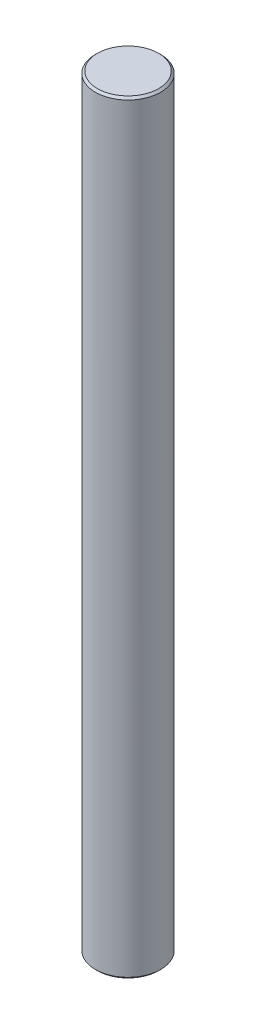
ISO-10303-21;
HEADER;
FILE_DESCRIPTION(('STEP AP214'),'2;1');
FILE_NAME('part.step','',(''),(''),'','','');
FILE_SCHEMA(('AUTOMOTIVE_DESIGN { 1 0 10303 214 1 1 1 1 }'));
ENDSEC;
DATA;
#1=APPLICATION_CONTEXT('core data for automotive mechanical design processes');
#2=APPLICATION_PROTOCOL_DEFINITION('international standard','automotive_design',2000,#1);
#3=PRODUCT_CONTEXT('',#1,'mechanical');
#4=PRODUCT('Part','Part','',(#3));
#5=PRODUCT_RELATED_PRODUCT_CATEGORY('part','',(#4));
#6=PRODUCT_DEFINITION_FORMATION('','',#4);
#7=PRODUCT_DEFINITION_CONTEXT('part definition',#1,'design');
#8=PRODUCT_DEFINITION('design','',#6,#7);
#9=PRODUCT_DEFINITION_SHAPE('','',#8);
#10=(LENGTH_UNIT() NAMED_UNIT(*) SI_UNIT(.MILLI.,.METRE.));
#11=(NAMED_UNIT(*) PLANE_ANGLE_UNIT() SI_UNIT($,.RADIAN.));
#12=(NAMED_UNIT(*) SI_UNIT($,.STERADIAN.) SOLID_ANGLE_UNIT());
#13=UNCERTAINTY_MEASURE_WITH_UNIT(LENGTH_MEASURE(1.E-05),#10,'distance_accuracy_value','');
#14=(GEOMETRIC_REPRESENTATION_CONTEXT(3) GLOBAL_UNCERTAINTY_ASSIGNED_CONTEXT((#13)) GLOBAL_UNIT_ASSIGNED_CONTEXT((#10,
#11,#12)) REPRESENTATION_CONTEXT('',''));
#15=CARTESIAN_POINT('',(0.,0.,0.));
#16=DIRECTION('',(0.,0.,1.));
#17=DIRECTION('',(1.,0.,0.));
#18=AXIS2_PLACEMENT_3D('',#15,#16,#17);
#19=CARTESIAN_POINT('',(0.,46.355,0.));
#20=DIRECTION('',(0.,-1.,0.));
#21=DIRECTION('',(0.,0.,-1.));
#22=AXIS2_PLACEMENT_3D('',#19,#20,#21);
#23=CYLINDRICAL_SURFACE('',#22,3.96875);
#24=CARTESIAN_POINT('',(0.,-46.1009999999999,0.));
#25=DIRECTION('',(0.,1.,0.));
#26=DIRECTION('',(0.,0.,1.));
#27=AXIS2_PLACEMENT_3D('',#24,#25,#26);
#28=CIRCLE('',#27,3.96875);
#29=CARTESIAN_POINT('',(0.,-46.1009999999999,-3.96875));
#30=VERTEX_POINT('',#29);
#31=EDGE_CURVE('E46',#30,#30,#28,.T.);
#32=CARTESIAN_POINT('',(0.,46.1010000000001,0.));
#33=DIRECTION('',(0.,1.,0.));
#34=DIRECTION('',(0.,0.,1.));
#35=AXIS2_PLACEMENT_3D('',#32,#33,#34);
#36=CIRCLE('',#35,3.96875);
#37=CARTESIAN_POINT('',(0.,46.1010000000001,-3.96875));
#38=VERTEX_POINT('',#37);
#39=EDGE_CURVE('E50',#38,#38,#36,.F.);
#40=CARTESIAN_POINT('',(0.,-46.1009999999999,-3.96875));
#41=CARTESIAN_POINT('',(0.,-45.1405624999999,-3.96875));
#42=CARTESIAN_POINT('',(0.,-44.1801249999999,-3.96875));
#43=CARTESIAN_POINT('',(0.,-42.2592499999999,-3.96875));
#44=CARTESIAN_POINT('',(0.,-41.2988124999999,-3.96875));
#45=CARTESIAN_POINT('',(0.,-39.3779374999999,-3.96875));
#46=CARTESIAN_POINT('',(0.,-38.4174999999999,-3.96875));
#47=CARTESIAN_POINT('',(0.,-36.4966249999999,-3.96875));
#48=CARTESIAN_POINT('',(0.,-35.5361874999999,-3.96875));
#49=CARTESIAN_POINT('',(0.,-33.6153124999999,-3.96875));
#50=CARTESIAN_POINT('',(0.,-32.6548749999999,-3.96875));
#51=CARTESIAN_POINT('',(0.,-30.7339999999999,-3.96875));
#52=CARTESIAN_POINT('',(0.,-29.7735624999999,-3.96875));
#53=CARTESIAN_POINT('',(0.,-27.8526874999999,-3.96875));
#54=CARTESIAN_POINT('',(0.,-26.8922499999999,-3.96875));
#55=CARTESIAN_POINT('',(0.,-24.9713749999999,-3.96875));
#56=CARTESIAN_POINT('',(0.,-24.0109374999999,-3.96875));
#57=CARTESIAN_POINT('',(0.,-22.0900624999999,-3.96875));
#58=CARTESIAN_POINT('',(0.,-21.1296249999999,-3.96875));
#59=CARTESIAN_POINT('',(0.,-19.2087499999999,-3.96875));
#60=CARTESIAN_POINT('',(0.,-18.2483124999999,-3.96875));
#61=CARTESIAN_POINT('',(0.,-16.3274374999999,-3.96875));
#62=CARTESIAN_POINT('',(0.,-15.3669999999999,-3.96875));
#63=CARTESIAN_POINT('',(0.,-13.4461249999999,-3.96875));
#64=CARTESIAN_POINT('',(0.,-12.4856874999999,-3.96875));
#65=CARTESIAN_POINT('',(0.,-10.5648124999999,-3.96875));
#66=CARTESIAN_POINT('',(0.,-9.6043749999999,-3.96875));
#67=CARTESIAN_POINT('',(0.,-7.6834999999999,-3.96875));
#68=CARTESIAN_POINT('',(0.,-6.7230624999999,-3.96875));
#69=CARTESIAN_POINT('',(0.,-4.8021874999999,-3.96875));
#70=CARTESIAN_POINT('',(0.,-3.8417499999999,-3.96875));
#71=CARTESIAN_POINT('',(0.,-1.9208749999999,-3.96875));
#72=CARTESIAN_POINT('',(0.,-0.960437499999901,-3.96875));
#73=CARTESIAN_POINT('',(0.,0.960437500000096,-3.96875));
#74=CARTESIAN_POINT('',(0.,1.92087500000009,-3.96875));
#75=CARTESIAN_POINT('',(0.,3.8417500000001,-3.96875));
#76=CARTESIAN_POINT('',(0.,4.8021875000001,-3.96875));
#77=CARTESIAN_POINT('',(0.,6.7230625000001,-3.96875));
#78=CARTESIAN_POINT('',(0.,7.6835000000001,-3.96875));
#79=CARTESIAN_POINT('',(0.,9.6043750000001,-3.96875));
#80=CARTESIAN_POINT('',(0.,10.5648125000001,-3.96875));
#81=CARTESIAN_POINT('',(0.,12.4856875000001,-3.96875));
#82=CARTESIAN_POINT('',(0.,13.4461250000001,-3.96875));
#83=CARTESIAN_POINT('',(0.,15.3670000000001,-3.96875));
#84=CARTESIAN_POINT('',(0.,16.3274375000001,-3.96875));
#85=CARTESIAN_POINT('',(0.,18.2483125000001,-3.96875));
#86=CARTESIAN_POINT('',(0.,19.2087500000001,-3.96875));
#87=CARTESIAN_POINT('',(0.,21.1296250000001,-3.96875));
#88=CARTESIAN_POINT('',(0.,22.0900625000001,-3.96875));
#89=CARTESIAN_POINT('',(0.,24.0109375000001,-3.96875));
#90=CARTESIAN_POINT('',(0.,24.9713750000001,-3.96875));
#91=CARTESIAN_POINT('',(0.,26.8922500000001,-3.96875));
#92=CARTESIAN_POINT('',(0.,27.8526875000001,-3.96875));
#93=CARTESIAN_POINT('',(0.,29.7735625000001,-3.96875));
#94=CARTESIAN_POINT('',(0.,30.7340000000001,-3.96875));
#95=CARTESIAN_POINT('',(0.,32.6548750000001,-3.96875));
#96=CARTESIAN_POINT('',(0.,33.6153125000001,-3.96875));
#97=CARTESIAN_POINT('',(0.,35.5361875000001,-3.96875));
#98=CARTESIAN_POINT('',(0.,36.4966250000001,-3.96875));
#99=CARTESIAN_POINT('',(0.,38.4175000000001,-3.96875));
#100=CARTESIAN_POINT('',(0.,39.3779375000001,-3.96875));
#101=CARTESIAN_POINT('',(0.,41.2988125000001,-3.96875));
#102=CARTESIAN_POINT('',(0.,42.2592500000001,-3.96875));
#103=CARTESIAN_POINT('',(0.,44.1801250000001,-3.96875));
#104=CARTESIAN_POINT('',(0.,45.1405625000001,-3.96875));
#105=CARTESIAN_POINT('',(0.,46.1010000000001,-3.96875));
#106=B_SPLINE_CURVE_WITH_KNOTS('',3,(#40,#41,#42,#43,#44,#45,#46,#47,#48,#49,#50,#51,#52,#53,
#54,#55,#56,#57,#58,#59,#60,#61,#62,#63,#64,#65,#66,#67,#68,#69,#70,#71,#72,#73,#74,#75,#76,#77,
#78,#79,#80,#81,#82,#83,#84,#85,#86,#87,#88,#89,#90,#91,#92,#93,#94,#95,#96,#97,#98,#99,#100,
#101,#102,#103,#104,#105),.UNSPECIFIED.,.F.,.F.,(4,2,2,2,2,2,2,2,2,2,2,2,2,2,2,2,2,2,2,2,2,2,2,
2,2,2,2,2,2,2,2,2,4),(0.,2.8813125,5.76262499999999,8.6439375,11.52525,14.4065625,17.287875,
20.1691875,23.0505,25.9318125,28.813125,31.6944375,34.57575,37.4570625,40.338375,43.2196875,
46.101,48.9823125,51.863625,54.7449375,57.62625,60.5075625,63.388875,66.2701875,69.1515,
72.0328125,74.914125,77.7954375,80.67675,83.5580625,86.439375,89.3206875,92.202),.UNSPECIFIED.);
#107=EDGE_CURVE('BSEAM35',#30,#38,#106,.T.);
#108=ORIENTED_EDGE('',*,*,#31,.T.);
#109=ORIENTED_EDGE('',*,*,#39,.T.);
#110=ORIENTED_EDGE('',*,*,#107,.T.);
#111=ORIENTED_EDGE('',*,*,#107,.F.);
#112=EDGE_LOOP('',(#108,#110,#109,#111));
#113=FACE_BOUND('',#112,.T.);
#114=ADVANCED_FACE('F35',(#113),#23,.T.);
#115=CARTESIAN_POINT('',(0.,46.355,0.));
#116=DIRECTION('',(0.,1.,0.));
#117=DIRECTION('',(0.,0.,1.));
#118=AXIS2_PLACEMENT_3D('',#115,#116,#117);
#119=PLANE('',#118);
#120=CARTESIAN_POINT('',(0.,46.355,0.));
#121=DIRECTION('',(0.,1.,0.));
#122=DIRECTION('',(0.,0.,1.));
#123=AXIS2_PLACEMENT_3D('',#120,#121,#122);
#124=CIRCLE('',#123,3.71475000000009);
#125=CARTESIAN_POINT('',(0.,46.355,3.71475000000009));
#126=VERTEX_POINT('',#125);
#127=EDGE_CURVE('E10',#126,#126,#124,.T.);
#128=ORIENTED_EDGE('',*,*,#127,.T.);
#129=EDGE_LOOP('',(#128));
#130=FACE_BOUND('',#129,.T.);
#131=ADVANCED_FACE('F66',(#130),#119,.T.);
#132=CARTESIAN_POINT('',(0.,-46.355,0.));
#133=DIRECTION('',(0.,1.,0.));
#134=DIRECTION('',(0.,0.,1.));
#135=AXIS2_PLACEMENT_3D('',#132,#133,#134);
#136=PLANE('',#135);
#137=CARTESIAN_POINT('',(0.,-46.355,0.));
#138=DIRECTION('',(0.,1.,0.));
#139=DIRECTION('',(0.,0.,1.));
#140=AXIS2_PLACEMENT_3D('',#137,#138,#139);
#141=CIRCLE('',#140,3.71474999999988);
#142=CARTESIAN_POINT('',(0.,-46.355,3.71474999999988));
#143=VERTEX_POINT('',#142);
#144=EDGE_CURVE('E42',#143,#143,#141,.F.);
#145=ORIENTED_EDGE('',*,*,#144,.T.);
#146=EDGE_LOOP('',(#145));
#147=FACE_BOUND('',#146,.T.);
#148=ADVANCED_FACE('F63',(#147),#136,.F.);
#149=CARTESIAN_POINT('',(0.,-46.1009999999999,0.));
#150=DIRECTION('',(0.,1.,0.));
#151=DIRECTION('',(0.,0.,1.));
#152=AXIS2_PLACEMENT_3D('',#149,#150,#151);
#153=CONICAL_SURFACE('',#152,3.96875,0.785398163397465);
#154=ORIENTED_EDGE('',*,*,#144,.F.);
#155=EDGE_LOOP('',(#154));
#156=FACE_BOUND('',#155,.T.);
#157=ORIENTED_EDGE('',*,*,#31,.F.);
#158=EDGE_LOOP('',(#157));
#159=FACE_BOUND('',#158,.T.);
#160=ADVANCED_FACE('F59',(#156,#159),#153,.T.);
#161=CARTESIAN_POINT('',(0.,46.355,0.));
#162=DIRECTION('',(0.,-1.,0.));
#163=DIRECTION('',(0.,0.,-1.));
#164=AXIS2_PLACEMENT_3D('',#161,#162,#163);
#165=CONICAL_SURFACE('',#164,3.71475000000009,0.785398163397452);
#166=ORIENTED_EDGE('',*,*,#39,.F.);
#167=EDGE_LOOP('',(#166));
#168=FACE_BOUND('',#167,.T.);
#169=ORIENTED_EDGE('',*,*,#127,.F.);
#170=EDGE_LOOP('',(#169));
#171=FACE_BOUND('',#170,.T.);
#172=ADVANCED_FACE('F37',(#168,#171),#165,.T.);
#173=CLOSED_SHELL('',(#114,#131,#148,#160,#172));
#174=MANIFOLD_SOLID_BREP('B2',#173);
#175=ADVANCED_BREP_SHAPE_REPRESENTATION('',(#18,#174),#14);
#176=SHAPE_DEFINITION_REPRESENTATION(#9,#175);
ENDSEC;
END-ISO-10303-21;
